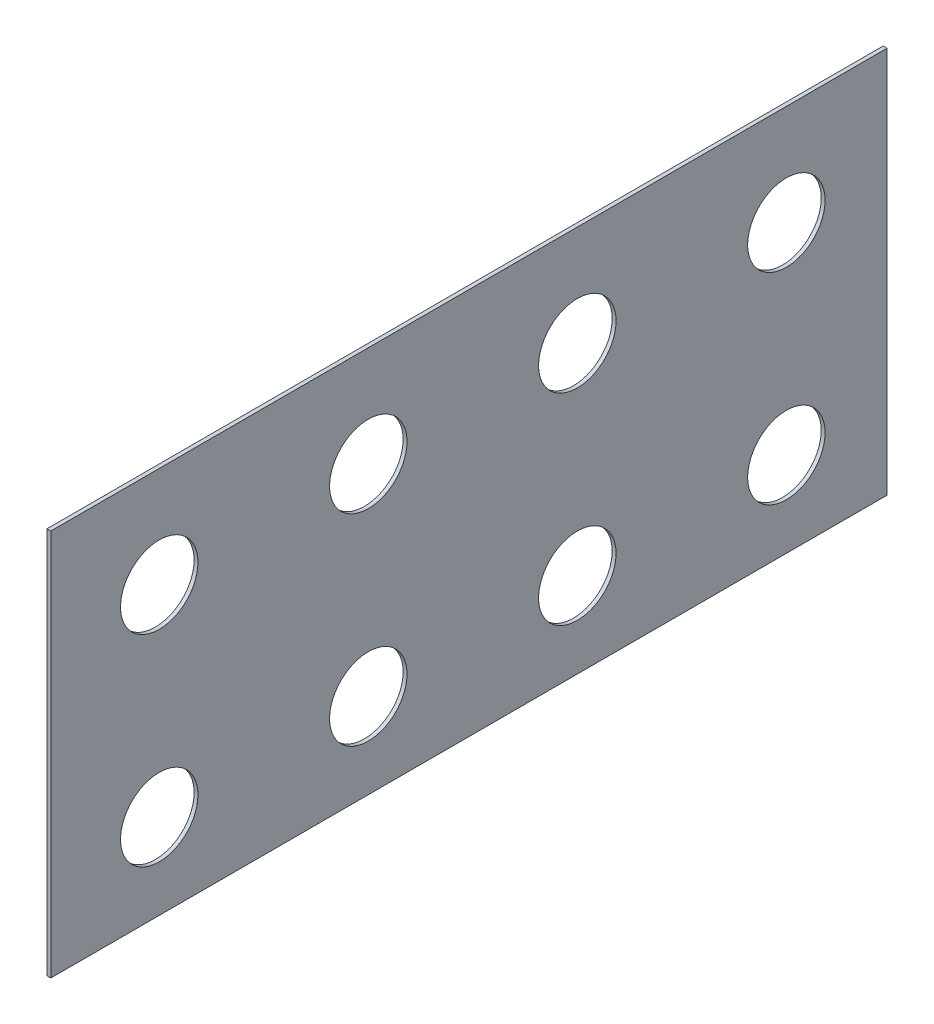
ISO-10303-21;
HEADER;
FILE_DESCRIPTION(('STEP AP214'),'2;1');
FILE_NAME('part.step','',(''),(''),'','','');
FILE_SCHEMA(('AUTOMOTIVE_DESIGN { 1 0 10303 214 1 1 1 1 }'));
ENDSEC;
DATA;
#1=APPLICATION_CONTEXT('core data for automotive mechanical design processes');
#2=APPLICATION_PROTOCOL_DEFINITION('international standard','automotive_design',2000,#1);
#3=PRODUCT_CONTEXT('',#1,'mechanical');
#4=PRODUCT('Part','Part','',(#3));
#5=PRODUCT_RELATED_PRODUCT_CATEGORY('part','',(#4));
#6=PRODUCT_DEFINITION_FORMATION('','',#4);
#7=PRODUCT_DEFINITION_CONTEXT('part definition',#1,'design');
#8=PRODUCT_DEFINITION('design','',#6,#7);
#9=PRODUCT_DEFINITION_SHAPE('','',#8);
#10=(LENGTH_UNIT() NAMED_UNIT(*) SI_UNIT(.MILLI.,.METRE.));
#11=(NAMED_UNIT(*) PLANE_ANGLE_UNIT() SI_UNIT($,.RADIAN.));
#12=(NAMED_UNIT(*) SI_UNIT($,.STERADIAN.) SOLID_ANGLE_UNIT());
#13=UNCERTAINTY_MEASURE_WITH_UNIT(LENGTH_MEASURE(1.E-05),#10,'distance_accuracy_value','');
#14=(GEOMETRIC_REPRESENTATION_CONTEXT(3) GLOBAL_UNCERTAINTY_ASSIGNED_CONTEXT((#13)) GLOBAL_UNIT_ASSIGNED_CONTEXT((#10,
#11,#12)) REPRESENTATION_CONTEXT('',''));
#15=CARTESIAN_POINT('',(0.,0.,0.));
#16=DIRECTION('',(0.,0.,1.));
#17=DIRECTION('',(1.,0.,0.));
#18=AXIS2_PLACEMENT_3D('',#15,#16,#17);
#19=CARTESIAN_POINT('',(5.,-250.,540.));
#20=DIRECTION('',(0.,0.,-1.));
#21=DIRECTION('',(-1.,0.,0.));
#22=AXIS2_PLACEMENT_3D('',#19,#20,#21);
#23=PLANE('',#22);
#24=DIRECTION('',(0.,-1.,0.));
#25=VECTOR('',#24,1.);
#26=CARTESIAN_POINT('',(0.,-250.,540.));
#27=LINE('',#26,#25);
#28=CARTESIAN_POINT('',(0.,250.,540.));
#29=VERTEX_POINT('',#28);
#30=CARTESIAN_POINT('',(0.,-250.,540.));
#31=VERTEX_POINT('',#30);
#32=EDGE_CURVE('E98',#29,#31,#27,.T.);
#33=ORIENTED_EDGE('',*,*,#32,.T.);
#34=DIRECTION('',(-1.,0.,0.));
#35=VECTOR('',#34,1.);
#36=CARTESIAN_POINT('',(5.,-250.,540.));
#37=LINE('',#36,#35);
#38=CARTESIAN_POINT('',(5.,-250.,540.));
#39=VERTEX_POINT('',#38);
#40=EDGE_CURVE('E11',#39,#31,#37,.T.);
#41=ORIENTED_EDGE('',*,*,#40,.F.);
#42=DIRECTION('',(0.,-1.,0.));
#43=VECTOR('',#42,1.);
#44=CARTESIAN_POINT('',(5.,-250.,540.));
#45=LINE('',#44,#43);
#46=CARTESIAN_POINT('',(5.,250.,540.));
#47=VERTEX_POINT('',#46);
#48=EDGE_CURVE('E86',#47,#39,#45,.T.);
#49=ORIENTED_EDGE('',*,*,#48,.F.);
#50=DIRECTION('',(-1.,0.,0.));
#51=VECTOR('',#50,1.);
#52=CARTESIAN_POINT('',(5.,250.,540.));
#53=LINE('',#52,#51);
#54=EDGE_CURVE('E94',#47,#29,#53,.T.);
#55=ORIENTED_EDGE('',*,*,#54,.T.);
#56=EDGE_LOOP('',(#33,#41,#49,#55));
#57=FACE_BOUND('',#56,.T.);
#58=ADVANCED_FACE('F35',(#57),#23,.F.);
#59=CARTESIAN_POINT('',(5.,-250.,-540.));
#60=DIRECTION('',(0.,1.,0.));
#61=DIRECTION('',(0.,0.,1.));
#62=AXIS2_PLACEMENT_3D('',#59,#60,#61);
#63=PLANE('',#62);
#64=DIRECTION('',(0.,0.,-1.));
#65=VECTOR('',#64,1.);
#66=CARTESIAN_POINT('',(0.,-250.,-540.));
#67=LINE('',#66,#65);
#68=CARTESIAN_POINT('',(0.,-250.,-540.));
#69=VERTEX_POINT('',#68);
#70=EDGE_CURVE('E90',#31,#69,#67,.T.);
#71=ORIENTED_EDGE('',*,*,#70,.T.);
#72=DIRECTION('',(-1.,0.,0.));
#73=VECTOR('',#72,1.);
#74=CARTESIAN_POINT('',(5.,-250.,-540.));
#75=LINE('',#74,#73);
#76=CARTESIAN_POINT('',(5.,-250.,-540.));
#77=VERTEX_POINT('',#76);
#78=EDGE_CURVE('E43',#77,#69,#75,.T.);
#79=ORIENTED_EDGE('',*,*,#78,.F.);
#80=DIRECTION('',(0.,0.,-1.));
#81=VECTOR('',#80,1.);
#82=CARTESIAN_POINT('',(5.,-250.,-540.));
#83=LINE('',#82,#81);
#84=EDGE_CURVE('E81',#39,#77,#83,.T.);
#85=ORIENTED_EDGE('',*,*,#84,.F.);
#86=ORIENTED_EDGE('',*,*,#40,.T.);
#87=EDGE_LOOP('',(#71,#79,#85,#86));
#88=FACE_BOUND('',#87,.T.);
#89=ADVANCED_FACE('F89',(#88),#63,.F.);
#90=CARTESIAN_POINT('',(5.,-250.,-540.));
#91=DIRECTION('',(0.,0.,1.));
#92=DIRECTION('',(1.,0.,0.));
#93=AXIS2_PLACEMENT_3D('',#90,#91,#92);
#94=PLANE('',#93);
#95=DIRECTION('',(0.,1.,0.));
#96=VECTOR('',#95,1.);
#97=CARTESIAN_POINT('',(0.,-250.,-540.));
#98=LINE('',#97,#96);
#99=CARTESIAN_POINT('',(0.,250.,-540.));
#100=VERTEX_POINT('',#99);
#101=EDGE_CURVE('E68',#69,#100,#98,.T.);
#102=ORIENTED_EDGE('',*,*,#101,.T.);
#103=DIRECTION('',(-1.,0.,0.));
#104=VECTOR('',#103,1.);
#105=CARTESIAN_POINT('',(5.,250.,-540.));
#106=LINE('',#105,#104);
#107=CARTESIAN_POINT('',(5.,250.,-540.));
#108=VERTEX_POINT('',#107);
#109=EDGE_CURVE('E91',#108,#100,#106,.T.);
#110=ORIENTED_EDGE('',*,*,#109,.F.);
#111=DIRECTION('',(0.,1.,0.));
#112=VECTOR('',#111,1.);
#113=CARTESIAN_POINT('',(5.,-250.,-540.));
#114=LINE('',#113,#112);
#115=EDGE_CURVE('E84',#77,#108,#114,.T.);
#116=ORIENTED_EDGE('',*,*,#115,.F.);
#117=ORIENTED_EDGE('',*,*,#78,.T.);
#118=EDGE_LOOP('',(#102,#110,#116,#117));
#119=FACE_BOUND('',#118,.T.);
#120=ADVANCED_FACE('F92',(#119),#94,.F.);
#121=CARTESIAN_POINT('',(5.,250.,-540.));
#122=DIRECTION('',(0.,-1.,0.));
#123=DIRECTION('',(0.,0.,-1.));
#124=AXIS2_PLACEMENT_3D('',#121,#122,#123);
#125=PLANE('',#124);
#126=DIRECTION('',(0.,0.,1.));
#127=VECTOR('',#126,1.);
#128=CARTESIAN_POINT('',(0.,250.,-540.));
#129=LINE('',#128,#127);
#130=EDGE_CURVE('E74',#100,#29,#129,.T.);
#131=ORIENTED_EDGE('',*,*,#130,.T.);
#132=ORIENTED_EDGE('',*,*,#54,.F.);
#133=DIRECTION('',(0.,0.,1.));
#134=VECTOR('',#133,1.);
#135=CARTESIAN_POINT('',(5.,250.,-540.));
#136=LINE('',#135,#134);
#137=EDGE_CURVE('E51',#108,#47,#136,.T.);
#138=ORIENTED_EDGE('',*,*,#137,.F.);
#139=ORIENTED_EDGE('',*,*,#109,.T.);
#140=EDGE_LOOP('',(#131,#132,#138,#139));
#141=FACE_BOUND('',#140,.T.);
#142=ADVANCED_FACE('F106',(#141),#125,.F.);
#143=CARTESIAN_POINT('',(5.,250.,540.));
#144=DIRECTION('',(1.,0.,0.));
#145=DIRECTION('',(0.,0.,-1.));
#146=AXIS2_PLACEMENT_3D('',#143,#144,#145);
#147=PLANE('',#146);
#148=CARTESIAN_POINT('',(5.,-140.,-410.000000000013));
#149=DIRECTION('',(1.,0.,0.));
#150=DIRECTION('',(0.,0.,-1.));
#151=AXIS2_PLACEMENT_3D('',#148,#149,#150);
#152=CIRCLE('',#151,50.);
#153=CARTESIAN_POINT('',(5.,-140.,-460.000000000013));
#154=VERTEX_POINT('',#153);
#155=EDGE_CURVE('E154',#154,#154,#152,.T.);
#156=ORIENTED_EDGE('',*,*,#155,.F.);
#157=EDGE_LOOP('',(#156));
#158=FACE_BOUND('',#157,.T.);
#159=CARTESIAN_POINT('',(5.,-140.,-140.000000000013));
#160=DIRECTION('',(1.,0.,0.));
#161=DIRECTION('',(0.,0.,-1.));
#162=AXIS2_PLACEMENT_3D('',#159,#160,#161);
#163=CIRCLE('',#162,50.);
#164=CARTESIAN_POINT('',(5.,-140.,-190.000000000013));
#165=VERTEX_POINT('',#164);
#166=EDGE_CURVE('E148',#165,#165,#163,.T.);
#167=ORIENTED_EDGE('',*,*,#166,.F.);
#168=EDGE_LOOP('',(#167));
#169=FACE_BOUND('',#168,.T.);
#170=CARTESIAN_POINT('',(5.,-140.,129.999999999987));
#171=DIRECTION('',(1.,0.,0.));
#172=DIRECTION('',(0.,0.,-1.));
#173=AXIS2_PLACEMENT_3D('',#170,#171,#172);
#174=CIRCLE('',#173,50.);
#175=CARTESIAN_POINT('',(5.,-140.,79.9999999999874));
#176=VERTEX_POINT('',#175);
#177=EDGE_CURVE('E142',#176,#176,#174,.T.);
#178=ORIENTED_EDGE('',*,*,#177,.F.);
#179=EDGE_LOOP('',(#178));
#180=FACE_BOUND('',#179,.T.);
#181=CARTESIAN_POINT('',(5.,-140.,399.999999999987));
#182=DIRECTION('',(1.,0.,0.));
#183=DIRECTION('',(0.,0.,-1.));
#184=AXIS2_PLACEMENT_3D('',#181,#182,#183);
#185=CIRCLE('',#184,50.);
#186=CARTESIAN_POINT('',(5.,-140.,349.999999999987));
#187=VERTEX_POINT('',#186);
#188=EDGE_CURVE('E136',#187,#187,#185,.T.);
#189=ORIENTED_EDGE('',*,*,#188,.F.);
#190=EDGE_LOOP('',(#189));
#191=FACE_BOUND('',#190,.T.);
#192=CARTESIAN_POINT('',(5.,120.,-410.000000000006));
#193=DIRECTION('',(1.,0.,0.));
#194=DIRECTION('',(0.,0.,-1.));
#195=AXIS2_PLACEMENT_3D('',#192,#193,#194);
#196=CIRCLE('',#195,50.);
#197=CARTESIAN_POINT('',(5.,120.,-460.000000000006));
#198=VERTEX_POINT('',#197);
#199=EDGE_CURVE('E130',#198,#198,#196,.T.);
#200=ORIENTED_EDGE('',*,*,#199,.F.);
#201=EDGE_LOOP('',(#200));
#202=FACE_BOUND('',#201,.T.);
#203=CARTESIAN_POINT('',(5.,120.,-140.000000000006));
#204=DIRECTION('',(1.,0.,0.));
#205=DIRECTION('',(0.,0.,-1.));
#206=AXIS2_PLACEMENT_3D('',#203,#204,#205);
#207=CIRCLE('',#206,50.);
#208=CARTESIAN_POINT('',(5.,120.,-190.000000000006));
#209=VERTEX_POINT('',#208);
#210=EDGE_CURVE('E124',#209,#209,#207,.T.);
#211=ORIENTED_EDGE('',*,*,#210,.F.);
#212=EDGE_LOOP('',(#211));
#213=FACE_BOUND('',#212,.T.);
#214=CARTESIAN_POINT('',(5.,120.,129.999999999994));
#215=DIRECTION('',(1.,0.,0.));
#216=DIRECTION('',(0.,0.,-1.));
#217=AXIS2_PLACEMENT_3D('',#214,#215,#216);
#218=CIRCLE('',#217,50.);
#219=CARTESIAN_POINT('',(5.,120.,79.9999999999938));
#220=VERTEX_POINT('',#219);
#221=EDGE_CURVE('E118',#220,#220,#218,.T.);
#222=ORIENTED_EDGE('',*,*,#221,.F.);
#223=EDGE_LOOP('',(#222));
#224=FACE_BOUND('',#223,.T.);
#225=CARTESIAN_POINT('',(5.,120.,399.999999999994));
#226=DIRECTION('',(1.,0.,0.));
#227=DIRECTION('',(0.,0.,-1.));
#228=AXIS2_PLACEMENT_3D('',#225,#226,#227);
#229=CIRCLE('',#228,50.);
#230=CARTESIAN_POINT('',(5.,120.,349.999999999994));
#231=VERTEX_POINT('',#230);
#232=EDGE_CURVE('E112',#231,#231,#229,.T.);
#233=ORIENTED_EDGE('',*,*,#232,.F.);
#234=EDGE_LOOP('',(#233));
#235=FACE_BOUND('',#234,.T.);
#236=ORIENTED_EDGE('',*,*,#48,.T.);
#237=ORIENTED_EDGE('',*,*,#84,.T.);
#238=ORIENTED_EDGE('',*,*,#115,.T.);
#239=ORIENTED_EDGE('',*,*,#137,.T.);
#240=EDGE_LOOP('',(#236,#237,#238,#239));
#241=FACE_BOUND('',#240,.T.);
#242=ADVANCED_FACE('F82',(#158,#169,#180,#191,#202,#213,#224,#235,#241),#147,.T.);
#243=CARTESIAN_POINT('',(0.,250.,540.));
#244=DIRECTION('',(1.,0.,0.));
#245=DIRECTION('',(0.,0.,-1.));
#246=AXIS2_PLACEMENT_3D('',#243,#244,#245);
#247=PLANE('',#246);
#248=CARTESIAN_POINT('',(0.,-140.,-410.000000000013));
#249=DIRECTION('',(1.,0.,0.));
#250=DIRECTION('',(0.,0.,-1.));
#251=AXIS2_PLACEMENT_3D('',#248,#249,#250);
#252=CIRCLE('',#251,50.);
#253=CARTESIAN_POINT('',(0.,-140.,-460.000000000013));
#254=VERTEX_POINT('',#253);
#255=EDGE_CURVE('E151',#254,#254,#252,.T.);
#256=ORIENTED_EDGE('',*,*,#255,.T.);
#257=EDGE_LOOP('',(#256));
#258=FACE_BOUND('',#257,.T.);
#259=CARTESIAN_POINT('',(0.,-140.,-140.000000000013));
#260=DIRECTION('',(1.,0.,0.));
#261=DIRECTION('',(0.,0.,-1.));
#262=AXIS2_PLACEMENT_3D('',#259,#260,#261);
#263=CIRCLE('',#262,50.);
#264=CARTESIAN_POINT('',(0.,-140.,-190.000000000013));
#265=VERTEX_POINT('',#264);
#266=EDGE_CURVE('E145',#265,#265,#263,.T.);
#267=ORIENTED_EDGE('',*,*,#266,.T.);
#268=EDGE_LOOP('',(#267));
#269=FACE_BOUND('',#268,.T.);
#270=CARTESIAN_POINT('',(0.,-140.,129.999999999987));
#271=DIRECTION('',(1.,0.,0.));
#272=DIRECTION('',(0.,0.,-1.));
#273=AXIS2_PLACEMENT_3D('',#270,#271,#272);
#274=CIRCLE('',#273,50.);
#275=CARTESIAN_POINT('',(0.,-140.,79.9999999999874));
#276=VERTEX_POINT('',#275);
#277=EDGE_CURVE('E139',#276,#276,#274,.T.);
#278=ORIENTED_EDGE('',*,*,#277,.T.);
#279=EDGE_LOOP('',(#278));
#280=FACE_BOUND('',#279,.T.);
#281=CARTESIAN_POINT('',(0.,-140.,399.999999999987));
#282=DIRECTION('',(1.,0.,0.));
#283=DIRECTION('',(0.,0.,-1.));
#284=AXIS2_PLACEMENT_3D('',#281,#282,#283);
#285=CIRCLE('',#284,50.);
#286=CARTESIAN_POINT('',(0.,-140.,349.999999999987));
#287=VERTEX_POINT('',#286);
#288=EDGE_CURVE('E133',#287,#287,#285,.T.);
#289=ORIENTED_EDGE('',*,*,#288,.T.);
#290=EDGE_LOOP('',(#289));
#291=FACE_BOUND('',#290,.T.);
#292=CARTESIAN_POINT('',(0.,120.,-410.000000000006));
#293=DIRECTION('',(1.,0.,0.));
#294=DIRECTION('',(0.,0.,-1.));
#295=AXIS2_PLACEMENT_3D('',#292,#293,#294);
#296=CIRCLE('',#295,50.);
#297=CARTESIAN_POINT('',(0.,120.,-460.000000000006));
#298=VERTEX_POINT('',#297);
#299=EDGE_CURVE('E127',#298,#298,#296,.T.);
#300=ORIENTED_EDGE('',*,*,#299,.T.);
#301=EDGE_LOOP('',(#300));
#302=FACE_BOUND('',#301,.T.);
#303=CARTESIAN_POINT('',(0.,120.,-140.000000000006));
#304=DIRECTION('',(1.,0.,0.));
#305=DIRECTION('',(0.,0.,-1.));
#306=AXIS2_PLACEMENT_3D('',#303,#304,#305);
#307=CIRCLE('',#306,50.);
#308=CARTESIAN_POINT('',(0.,120.,-190.000000000006));
#309=VERTEX_POINT('',#308);
#310=EDGE_CURVE('E121',#309,#309,#307,.T.);
#311=ORIENTED_EDGE('',*,*,#310,.T.);
#312=EDGE_LOOP('',(#311));
#313=FACE_BOUND('',#312,.T.);
#314=CARTESIAN_POINT('',(0.,120.,129.999999999994));
#315=DIRECTION('',(1.,0.,0.));
#316=DIRECTION('',(0.,0.,-1.));
#317=AXIS2_PLACEMENT_3D('',#314,#315,#316);
#318=CIRCLE('',#317,50.);
#319=CARTESIAN_POINT('',(0.,120.,79.9999999999938));
#320=VERTEX_POINT('',#319);
#321=EDGE_CURVE('E115',#320,#320,#318,.T.);
#322=ORIENTED_EDGE('',*,*,#321,.T.);
#323=EDGE_LOOP('',(#322));
#324=FACE_BOUND('',#323,.T.);
#325=CARTESIAN_POINT('',(0.,120.,399.999999999994));
#326=DIRECTION('',(1.,0.,0.));
#327=DIRECTION('',(0.,0.,-1.));
#328=AXIS2_PLACEMENT_3D('',#325,#326,#327);
#329=CIRCLE('',#328,50.);
#330=CARTESIAN_POINT('',(0.,120.,349.999999999994));
#331=VERTEX_POINT('',#330);
#332=EDGE_CURVE('E101',#331,#331,#329,.T.);
#333=ORIENTED_EDGE('',*,*,#332,.T.);
#334=EDGE_LOOP('',(#333));
#335=FACE_BOUND('',#334,.T.);
#336=ORIENTED_EDGE('',*,*,#32,.F.);
#337=ORIENTED_EDGE('',*,*,#130,.F.);
#338=ORIENTED_EDGE('',*,*,#101,.F.);
#339=ORIENTED_EDGE('',*,*,#70,.F.);
#340=EDGE_LOOP('',(#336,#337,#338,#339));
#341=FACE_BOUND('',#340,.T.);
#342=ADVANCED_FACE('F109',(#258,#269,#280,#291,#302,#313,#324,#335,#341),#247,.F.);
#343=CARTESIAN_POINT('',(0.,120.,399.999999999994));
#344=DIRECTION('',(1.,0.,0.));
#345=DIRECTION('',(0.,0.,-1.));
#346=AXIS2_PLACEMENT_3D('',#343,#344,#345);
#347=CYLINDRICAL_SURFACE('',#346,50.);
#348=ORIENTED_EDGE('',*,*,#332,.F.);
#349=EDGE_LOOP('',(#348));
#350=FACE_BOUND('',#349,.T.);
#351=ORIENTED_EDGE('',*,*,#232,.T.);
#352=EDGE_LOOP('',(#351));
#353=FACE_BOUND('',#352,.T.);
#354=ADVANCED_FACE('F186',(#350,#353),#347,.F.);
#355=CARTESIAN_POINT('',(0.,120.,129.999999999994));
#356=DIRECTION('',(1.,0.,0.));
#357=DIRECTION('',(0.,0.,-1.));
#358=AXIS2_PLACEMENT_3D('',#355,#356,#357);
#359=CYLINDRICAL_SURFACE('',#358,50.);
#360=ORIENTED_EDGE('',*,*,#321,.F.);
#361=EDGE_LOOP('',(#360));
#362=FACE_BOUND('',#361,.T.);
#363=ORIENTED_EDGE('',*,*,#221,.T.);
#364=EDGE_LOOP('',(#363));
#365=FACE_BOUND('',#364,.T.);
#366=ADVANCED_FACE('F188',(#362,#365),#359,.F.);
#367=CARTESIAN_POINT('',(0.,120.,-140.000000000006));
#368=DIRECTION('',(1.,0.,0.));
#369=DIRECTION('',(0.,0.,-1.));
#370=AXIS2_PLACEMENT_3D('',#367,#368,#369);
#371=CYLINDRICAL_SURFACE('',#370,50.);
#372=ORIENTED_EDGE('',*,*,#310,.F.);
#373=EDGE_LOOP('',(#372));
#374=FACE_BOUND('',#373,.T.);
#375=ORIENTED_EDGE('',*,*,#210,.T.);
#376=EDGE_LOOP('',(#375));
#377=FACE_BOUND('',#376,.T.);
#378=ADVANCED_FACE('F195',(#374,#377),#371,.F.);
#379=CARTESIAN_POINT('',(0.,120.,-410.000000000006));
#380=DIRECTION('',(1.,0.,0.));
#381=DIRECTION('',(0.,0.,-1.));
#382=AXIS2_PLACEMENT_3D('',#379,#380,#381);
#383=CYLINDRICAL_SURFACE('',#382,50.);
#384=ORIENTED_EDGE('',*,*,#299,.F.);
#385=EDGE_LOOP('',(#384));
#386=FACE_BOUND('',#385,.T.);
#387=ORIENTED_EDGE('',*,*,#199,.T.);
#388=EDGE_LOOP('',(#387));
#389=FACE_BOUND('',#388,.T.);
#390=ADVANCED_FACE('F241',(#386,#389),#383,.F.);
#391=CARTESIAN_POINT('',(0.,-140.,399.999999999987));
#392=DIRECTION('',(1.,0.,0.));
#393=DIRECTION('',(0.,0.,-1.));
#394=AXIS2_PLACEMENT_3D('',#391,#392,#393);
#395=CYLINDRICAL_SURFACE('',#394,50.);
#396=ORIENTED_EDGE('',*,*,#288,.F.);
#397=EDGE_LOOP('',(#396));
#398=FACE_BOUND('',#397,.T.);
#399=ORIENTED_EDGE('',*,*,#188,.T.);
#400=EDGE_LOOP('',(#399));
#401=FACE_BOUND('',#400,.T.);
#402=ADVANCED_FACE('F251',(#398,#401),#395,.F.);
#403=CARTESIAN_POINT('',(0.,-140.,129.999999999987));
#404=DIRECTION('',(1.,0.,0.));
#405=DIRECTION('',(0.,0.,-1.));
#406=AXIS2_PLACEMENT_3D('',#403,#404,#405);
#407=CYLINDRICAL_SURFACE('',#406,50.);
#408=ORIENTED_EDGE('',*,*,#277,.F.);
#409=EDGE_LOOP('',(#408));
#410=FACE_BOUND('',#409,.T.);
#411=ORIENTED_EDGE('',*,*,#177,.T.);
#412=EDGE_LOOP('',(#411));
#413=FACE_BOUND('',#412,.T.);
#414=ADVANCED_FACE('F261',(#410,#413),#407,.F.);
#415=CARTESIAN_POINT('',(0.,-140.,-140.000000000013));
#416=DIRECTION('',(1.,0.,0.));
#417=DIRECTION('',(0.,0.,-1.));
#418=AXIS2_PLACEMENT_3D('',#415,#416,#417);
#419=CYLINDRICAL_SURFACE('',#418,50.);
#420=ORIENTED_EDGE('',*,*,#266,.F.);
#421=EDGE_LOOP('',(#420));
#422=FACE_BOUND('',#421,.T.);
#423=ORIENTED_EDGE('',*,*,#166,.T.);
#424=EDGE_LOOP('',(#423));
#425=FACE_BOUND('',#424,.T.);
#426=ADVANCED_FACE('F165',(#422,#425),#419,.F.);
#427=CARTESIAN_POINT('',(0.,-140.,-410.000000000013));
#428=DIRECTION('',(1.,0.,0.));
#429=DIRECTION('',(0.,0.,-1.));
#430=AXIS2_PLACEMENT_3D('',#427,#428,#429);
#431=CYLINDRICAL_SURFACE('',#430,50.);
#432=ORIENTED_EDGE('',*,*,#255,.F.);
#433=EDGE_LOOP('',(#432));
#434=FACE_BOUND('',#433,.T.);
#435=ORIENTED_EDGE('',*,*,#155,.T.);
#436=EDGE_LOOP('',(#435));
#437=FACE_BOUND('',#436,.T.);
#438=ADVANCED_FACE('F162',(#434,#437),#431,.F.);
#439=CLOSED_SHELL('',(#58,#89,#120,#142,#242,#342,#354,#366,#378,#390,#402,#414,#426,#438));
#440=MANIFOLD_SOLID_BREP('B2',#439);
#441=ADVANCED_BREP_SHAPE_REPRESENTATION('',(#18,#440),#14);
#442=SHAPE_DEFINITION_REPRESENTATION(#9,#441);
ENDSEC;
END-ISO-10303-21;
